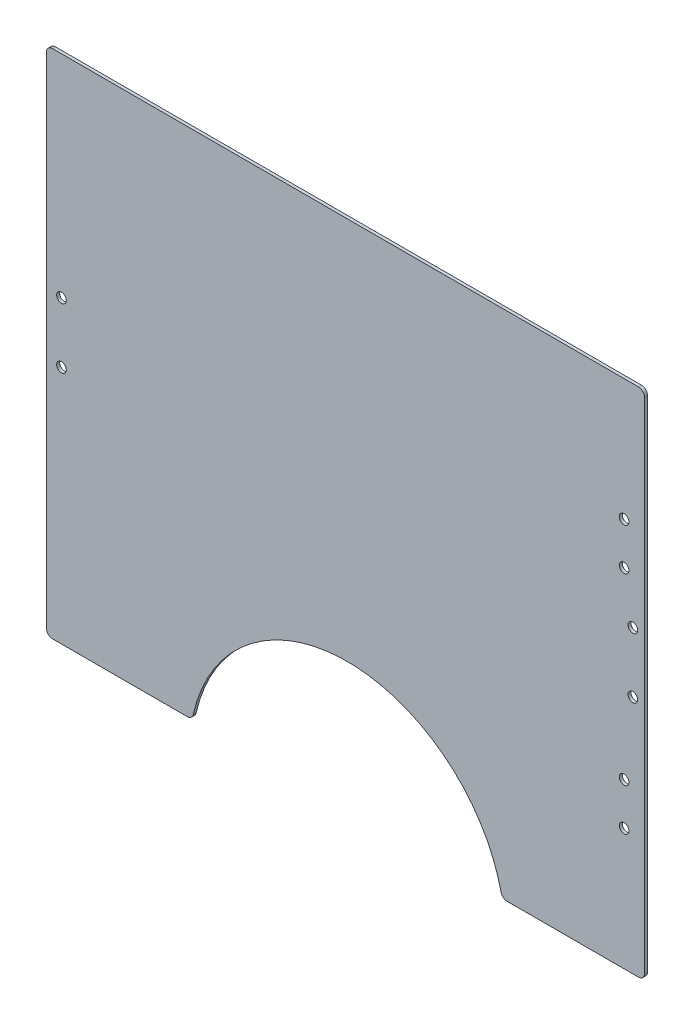
ISO-10303-21;
HEADER;
FILE_DESCRIPTION(('STEP AP214'),'2;1');
FILE_NAME('part.step','',(''),(''),'','','');
FILE_SCHEMA(('AUTOMOTIVE_DESIGN { 1 0 10303 214 1 1 1 1 }'));
ENDSEC;
DATA;
#1=APPLICATION_CONTEXT('core data for automotive mechanical design processes');
#2=APPLICATION_PROTOCOL_DEFINITION('international standard','automotive_design',2000,#1);
#3=PRODUCT_CONTEXT('',#1,'mechanical');
#4=PRODUCT('Part','Part','',(#3));
#5=PRODUCT_RELATED_PRODUCT_CATEGORY('part','',(#4));
#6=PRODUCT_DEFINITION_FORMATION('','',#4);
#7=PRODUCT_DEFINITION_CONTEXT('part definition',#1,'design');
#8=PRODUCT_DEFINITION('design','',#6,#7);
#9=PRODUCT_DEFINITION_SHAPE('','',#8);
#10=(LENGTH_UNIT() NAMED_UNIT(*) SI_UNIT(.MILLI.,.METRE.));
#11=(NAMED_UNIT(*) PLANE_ANGLE_UNIT() SI_UNIT($,.RADIAN.));
#12=(NAMED_UNIT(*) SI_UNIT($,.STERADIAN.) SOLID_ANGLE_UNIT());
#13=UNCERTAINTY_MEASURE_WITH_UNIT(LENGTH_MEASURE(1.E-05),#10,'distance_accuracy_value','');
#14=(GEOMETRIC_REPRESENTATION_CONTEXT(3) GLOBAL_UNCERTAINTY_ASSIGNED_CONTEXT((#13)) GLOBAL_UNIT_ASSIGNED_CONTEXT((#10,
#11,#12)) REPRESENTATION_CONTEXT('',''));
#15=CARTESIAN_POINT('',(0.,0.,0.));
#16=DIRECTION('',(0.,0.,1.));
#17=DIRECTION('',(1.,0.,0.));
#18=AXIS2_PLACEMENT_3D('',#15,#16,#17);
#19=CARTESIAN_POINT('',(-100.,-85.,1.));
#20=DIRECTION('',(0.,1.,0.));
#21=DIRECTION('',(0.,0.,1.));
#22=AXIS2_PLACEMENT_3D('',#19,#20,#21);
#23=PLANE('',#22);
#24=DIRECTION('',(1.,0.,0.));
#25=VECTOR('',#24,1.);
#26=CARTESIAN_POINT('',(-100.,-85.,0.));
#27=LINE('',#26,#25);
#28=CARTESIAN_POINT('',(53.1624867740402,-85.,0.));
#29=VERTEX_POINT('',#28);
#30=CARTESIAN_POINT('',(96.9,-85.,0.));
#31=VERTEX_POINT('',#30);
#32=EDGE_CURVE('E219',#29,#31,#27,.T.);
#33=ORIENTED_EDGE('',*,*,#32,.T.);
#34=DIRECTION('',(0.,0.,-1.));
#35=VECTOR('',#34,1.);
#36=CARTESIAN_POINT('',(96.9,-85.,1.));
#37=LINE('',#36,#35);
#38=CARTESIAN_POINT('',(96.9,-85.,1.));
#39=VERTEX_POINT('',#38);
#40=EDGE_CURVE('E181',#31,#39,#37,.F.);
#41=ORIENTED_EDGE('',*,*,#40,.T.);
#42=DIRECTION('',(1.,0.,0.));
#43=VECTOR('',#42,1.);
#44=CARTESIAN_POINT('',(-100.,-85.,1.));
#45=LINE('',#44,#43);
#46=CARTESIAN_POINT('',(53.1624867740402,-85.,1.));
#47=VERTEX_POINT('',#46);
#48=EDGE_CURVE('E205',#47,#39,#45,.T.);
#49=ORIENTED_EDGE('',*,*,#48,.F.);
#50=DIRECTION('',(0.,0.,-1.));
#51=VECTOR('',#50,1.);
#52=CARTESIAN_POINT('',(53.1624867740402,-85.,1.));
#53=LINE('',#52,#51);
#54=EDGE_CURVE('E134',#47,#29,#53,.T.);
#55=ORIENTED_EDGE('',*,*,#54,.T.);
#56=EDGE_LOOP('',(#33,#41,#49,#55));
#57=FACE_BOUND('',#56,.T.);
#58=ADVANCED_FACE('F36',(#57),#23,.F.);
#59=CARTESIAN_POINT('',(-100.,85.,1.));
#60=DIRECTION('',(0.,-1.,0.));
#61=DIRECTION('',(0.,0.,-1.));
#62=AXIS2_PLACEMENT_3D('',#59,#60,#61);
#63=PLANE('',#62);
#64=DIRECTION('',(-1.,0.,0.));
#65=VECTOR('',#64,1.);
#66=CARTESIAN_POINT('',(-100.,85.,1.));
#67=LINE('',#66,#65);
#68=CARTESIAN_POINT('',(96.9,85.,1.));
#69=VERTEX_POINT('',#68);
#70=CARTESIAN_POINT('',(-98.,85.,1.));
#71=VERTEX_POINT('',#70);
#72=EDGE_CURVE('E127',#69,#71,#67,.T.);
#73=ORIENTED_EDGE('',*,*,#72,.F.);
#74=DIRECTION('',(0.,0.,-1.));
#75=VECTOR('',#74,1.);
#76=CARTESIAN_POINT('',(96.9,85.,1.));
#77=LINE('',#76,#75);
#78=CARTESIAN_POINT('',(96.9,85.,0.));
#79=VERTEX_POINT('',#78);
#80=EDGE_CURVE('E141',#69,#79,#77,.T.);
#81=ORIENTED_EDGE('',*,*,#80,.T.);
#82=DIRECTION('',(-1.,0.,0.));
#83=VECTOR('',#82,1.);
#84=CARTESIAN_POINT('',(-100.,85.,0.));
#85=LINE('',#84,#83);
#86=CARTESIAN_POINT('',(-98.,85.,0.));
#87=VERTEX_POINT('',#86);
#88=EDGE_CURVE('E223',#79,#87,#85,.T.);
#89=ORIENTED_EDGE('',*,*,#88,.T.);
#90=DIRECTION('',(0.,0.,-1.));
#91=VECTOR('',#90,1.);
#92=CARTESIAN_POINT('',(-98.,85.,1.));
#93=LINE('',#92,#91);
#94=EDGE_CURVE('E144',#87,#71,#93,.F.);
#95=ORIENTED_EDGE('',*,*,#94,.T.);
#96=EDGE_LOOP('',(#73,#81,#89,#95));
#97=FACE_BOUND('',#96,.T.);
#98=ADVANCED_FACE('F139',(#97),#63,.F.);
#99=CARTESIAN_POINT('',(-100.,-85.,1.));
#100=DIRECTION('',(1.,0.,0.));
#101=DIRECTION('',(0.,0.,-1.));
#102=AXIS2_PLACEMENT_3D('',#99,#100,#101);
#103=PLANE('',#102);
#104=DIRECTION('',(0.,-1.,0.));
#105=VECTOR('',#104,1.);
#106=CARTESIAN_POINT('',(-100.,-85.,0.));
#107=LINE('',#106,#105);
#108=CARTESIAN_POINT('',(-100.,83.,0.));
#109=VERTEX_POINT('',#108);
#110=CARTESIAN_POINT('',(-100.,-83.,0.));
#111=VERTEX_POINT('',#110);
#112=EDGE_CURVE('E201',#109,#111,#107,.T.);
#113=ORIENTED_EDGE('',*,*,#112,.T.);
#114=DIRECTION('',(0.,0.,-1.));
#115=VECTOR('',#114,1.);
#116=CARTESIAN_POINT('',(-100.,-83.,1.));
#117=LINE('',#116,#115);
#118=CARTESIAN_POINT('',(-100.,-83.,1.));
#119=VERTEX_POINT('',#118);
#120=EDGE_CURVE('E192',#111,#119,#117,.F.);
#121=ORIENTED_EDGE('',*,*,#120,.T.);
#122=DIRECTION('',(0.,-1.,0.));
#123=VECTOR('',#122,1.);
#124=CARTESIAN_POINT('',(-100.,-85.,1.));
#125=LINE('',#124,#123);
#126=CARTESIAN_POINT('',(-100.,83.,1.));
#127=VERTEX_POINT('',#126);
#128=EDGE_CURVE('E145',#127,#119,#125,.T.);
#129=ORIENTED_EDGE('',*,*,#128,.F.);
#130=DIRECTION('',(0.,0.,-1.));
#131=VECTOR('',#130,1.);
#132=CARTESIAN_POINT('',(-100.,83.,1.));
#133=LINE('',#132,#131);
#134=EDGE_CURVE('E189',#127,#109,#133,.T.);
#135=ORIENTED_EDGE('',*,*,#134,.T.);
#136=EDGE_LOOP('',(#113,#121,#129,#135));
#137=FACE_BOUND('',#136,.T.);
#138=ADVANCED_FACE('F198',(#137),#103,.F.);
#139=CARTESIAN_POINT('',(-98.,-85.,1.));
#140=VERTEX_POINT('',#139);
#141=CARTESIAN_POINT('',(-53.1624867740402,-85.,1.));
#142=VERTEX_POINT('',#141);
#143=EDGE_CURVE('E154',#140,#142,#45,.T.);
#144=ORIENTED_EDGE('',*,*,#143,.F.);
#145=DIRECTION('',(0.,0.,-1.));
#146=VECTOR('',#145,1.);
#147=CARTESIAN_POINT('',(-98.,-85.,1.));
#148=LINE('',#147,#146);
#149=CARTESIAN_POINT('',(-98.,-85.,0.));
#150=VERTEX_POINT('',#149);
#151=EDGE_CURVE('E186',#140,#150,#148,.T.);
#152=ORIENTED_EDGE('',*,*,#151,.T.);
#153=CARTESIAN_POINT('',(-53.1624867740402,-85.,0.));
#154=VERTEX_POINT('',#153);
#155=EDGE_CURVE('E146',#150,#154,#27,.T.);
#156=ORIENTED_EDGE('',*,*,#155,.T.);
#157=DIRECTION('',(0.,0.,-1.));
#158=VECTOR('',#157,1.);
#159=CARTESIAN_POINT('',(-53.1624867740402,-85.,1.));
#160=LINE('',#159,#158);
#161=EDGE_CURVE('E183',#154,#142,#160,.F.);
#162=ORIENTED_EDGE('',*,*,#161,.T.);
#163=EDGE_LOOP('',(#144,#152,#156,#162));
#164=FACE_BOUND('',#163,.T.);
#165=ADVANCED_FACE('F212',(#164),#23,.F.);
#166=CARTESIAN_POINT('',(0.,0.,1.));
#167=DIRECTION('',(0.,0.,-1.));
#168=DIRECTION('',(-1.,0.,0.));
#169=AXIS2_PLACEMENT_3D('',#166,#167,#168);
#170=PLANE('',#169);
#171=CARTESIAN_POINT('',(92.1,44.5,0.999999999999999));
#172=DIRECTION('',(0.,0.,-1.));
#173=DIRECTION('',(-1.,0.,0.));
#174=AXIS2_PLACEMENT_3D('',#171,#172,#173);
#175=CIRCLE('',#174,1.60000000000001);
#176=CARTESIAN_POINT('',(90.5,44.5,0.999999999999999));
#177=VERTEX_POINT('',#176);
#178=EDGE_CURVE('E258',#177,#177,#175,.T.);
#179=ORIENTED_EDGE('',*,*,#178,.T.);
#180=EDGE_LOOP('',(#179));
#181=FACE_BOUND('',#180,.T.);
#182=CARTESIAN_POINT('',(92.1,30.5,0.999999999999999));
#183=DIRECTION('',(0.,0.,-1.));
#184=DIRECTION('',(-1.,0.,0.));
#185=AXIS2_PLACEMENT_3D('',#182,#183,#184);
#186=CIRCLE('',#185,1.6);
#187=CARTESIAN_POINT('',(90.5,30.5,0.999999999999999));
#188=VERTEX_POINT('',#187);
#189=EDGE_CURVE('E261',#188,#188,#186,.T.);
#190=ORIENTED_EDGE('',*,*,#189,.T.);
#191=EDGE_LOOP('',(#190));
#192=FACE_BOUND('',#191,.T.);
#193=CARTESIAN_POINT('',(92.1,-30.5000000000001,0.999999999999999));
#194=DIRECTION('',(0.,0.,-1.));
#195=DIRECTION('',(-1.,0.,0.));
#196=AXIS2_PLACEMENT_3D('',#193,#194,#195);
#197=CIRCLE('',#196,1.6);
#198=CARTESIAN_POINT('',(90.5,-30.5000000000001,0.999999999999999));
#199=VERTEX_POINT('',#198);
#200=EDGE_CURVE('E264',#199,#199,#197,.T.);
#201=ORIENTED_EDGE('',*,*,#200,.T.);
#202=EDGE_LOOP('',(#201));
#203=FACE_BOUND('',#202,.T.);
#204=CARTESIAN_POINT('',(92.1,-44.5000000000001,0.999999999999999));
#205=DIRECTION('',(0.,0.,-1.));
#206=DIRECTION('',(-1.,0.,0.));
#207=AXIS2_PLACEMENT_3D('',#204,#205,#206);
#208=CIRCLE('',#207,1.60000000000001);
#209=CARTESIAN_POINT('',(90.5,-44.5000000000001,0.999999999999999));
#210=VERTEX_POINT('',#209);
#211=EDGE_CURVE('E267',#210,#210,#208,.T.);
#212=ORIENTED_EDGE('',*,*,#211,.T.);
#213=EDGE_LOOP('',(#212));
#214=FACE_BOUND('',#213,.T.);
#215=CARTESIAN_POINT('',(95.,14.7224845011376,1.));
#216=DIRECTION('',(0.,0.,1.));
#217=DIRECTION('',(1.,0.,0.));
#218=AXIS2_PLACEMENT_3D('',#215,#216,#217);
#219=CIRCLE('',#218,1.6);
#220=CARTESIAN_POINT('',(96.6,14.7224845011376,1.));
#221=VERTEX_POINT('',#220);
#222=EDGE_CURVE('E235',#221,#221,#219,.T.);
#223=ORIENTED_EDGE('',*,*,#222,.F.);
#224=EDGE_LOOP('',(#223));
#225=FACE_BOUND('',#224,.T.);
#226=CARTESIAN_POINT('',(95.,-5.27751549886241,1.));
#227=DIRECTION('',(0.,0.,1.));
#228=DIRECTION('',(1.,0.,0.));
#229=AXIS2_PLACEMENT_3D('',#226,#227,#228);
#230=CIRCLE('',#229,1.60000000000001);
#231=CARTESIAN_POINT('',(96.6,-5.27751549886241,1.));
#232=VERTEX_POINT('',#231);
#233=EDGE_CURVE('E246',#232,#232,#230,.T.);
#234=ORIENTED_EDGE('',*,*,#233,.F.);
#235=EDGE_LOOP('',(#234));
#236=FACE_BOUND('',#235,.T.);
#237=CARTESIAN_POINT('',(-95.,14.7224845011376,1.));
#238=DIRECTION('',(0.,0.,-1.));
#239=DIRECTION('',(-1.,0.,0.));
#240=AXIS2_PLACEMENT_3D('',#237,#238,#239);
#241=CIRCLE('',#240,1.6);
#242=CARTESIAN_POINT('',(-96.6,14.7224845011376,1.));
#243=VERTEX_POINT('',#242);
#244=EDGE_CURVE('E230',#243,#243,#241,.T.);
#245=ORIENTED_EDGE('',*,*,#244,.T.);
#246=EDGE_LOOP('',(#245));
#247=FACE_BOUND('',#246,.T.);
#248=CARTESIAN_POINT('',(-95.,-5.27751549886241,1.));
#249=DIRECTION('',(0.,0.,-1.));
#250=DIRECTION('',(-1.,0.,0.));
#251=AXIS2_PLACEMENT_3D('',#248,#249,#250);
#252=CIRCLE('',#251,1.60000000000001);
#253=CARTESIAN_POINT('',(-96.6,-5.27751549886241,1.));
#254=VERTEX_POINT('',#253);
#255=EDGE_CURVE('E234',#254,#254,#252,.T.);
#256=ORIENTED_EDGE('',*,*,#255,.T.);
#257=EDGE_LOOP('',(#256));
#258=FACE_BOUND('',#257,.T.);
#259=DIRECTION('',(0.,1.,0.));
#260=VECTOR('',#259,1.);
#261=CARTESIAN_POINT('',(98.9,0.,1.));
#262=LINE('',#261,#260);
#263=CARTESIAN_POINT('',(98.9,-83.,1.));
#264=VERTEX_POINT('',#263);
#265=CARTESIAN_POINT('',(98.9,83.,1.));
#266=VERTEX_POINT('',#265);
#267=EDGE_CURVE('E130',#264,#266,#262,.T.);
#268=ORIENTED_EDGE('',*,*,#267,.T.);
#269=CARTESIAN_POINT('',(96.9,83.,1.));
#270=DIRECTION('',(0.,0.,-1.));
#271=DIRECTION('',(-1.,0.,0.));
#272=AXIS2_PLACEMENT_3D('',#269,#270,#271);
#273=CIRCLE('',#272,2.);
#274=EDGE_CURVE('E124',#266,#69,#273,.F.);
#275=ORIENTED_EDGE('',*,*,#274,.T.);
#276=ORIENTED_EDGE('',*,*,#72,.T.);
#277=CARTESIAN_POINT('',(-98.,83.,1.));
#278=DIRECTION('',(0.,0.,-1.));
#279=DIRECTION('',(-1.,0.,0.));
#280=AXIS2_PLACEMENT_3D('',#277,#278,#279);
#281=CIRCLE('',#280,2.);
#282=EDGE_CURVE('E174',#71,#127,#281,.F.);
#283=ORIENTED_EDGE('',*,*,#282,.T.);
#284=ORIENTED_EDGE('',*,*,#128,.T.);
#285=CARTESIAN_POINT('',(-98.,-83.,1.));
#286=DIRECTION('',(0.,0.,-1.));
#287=DIRECTION('',(-1.,0.,0.));
#288=AXIS2_PLACEMENT_3D('',#285,#286,#287);
#289=CIRCLE('',#288,2.);
#290=EDGE_CURVE('E176',#119,#140,#289,.F.);
#291=ORIENTED_EDGE('',*,*,#290,.T.);
#292=ORIENTED_EDGE('',*,*,#143,.T.);
#293=CARTESIAN_POINT('',(-53.1624867740402,-83.,1.));
#294=DIRECTION('',(0.,0.,-1.));
#295=DIRECTION('',(-1.,0.,0.));
#296=AXIS2_PLACEMENT_3D('',#293,#294,#295);
#297=CIRCLE('',#296,2.);
#298=CARTESIAN_POINT('',(-51.2115698282039,-83.4403669724771,1.));
#299=VERTEX_POINT('',#298);
#300=EDGE_CURVE('E57',#142,#299,#297,.F.);
#301=ORIENTED_EDGE('',*,*,#300,.T.);
#302=CARTESIAN_POINT('',(0.,-95.,1.));
#303=DIRECTION('',(0.,0.,-1.));
#304=DIRECTION('',(-1.,0.,0.));
#305=AXIS2_PLACEMENT_3D('',#302,#303,#304);
#306=CIRCLE('',#305,52.5);
#307=CARTESIAN_POINT('',(51.2115698282039,-83.4403669724771,1.));
#308=VERTEX_POINT('',#307);
#309=EDGE_CURVE('E225',#299,#308,#306,.T.);
#310=ORIENTED_EDGE('',*,*,#309,.T.);
#311=CARTESIAN_POINT('',(53.1624867740402,-83.,1.));
#312=DIRECTION('',(0.,0.,-1.));
#313=DIRECTION('',(-1.,0.,0.));
#314=AXIS2_PLACEMENT_3D('',#311,#312,#313);
#315=CIRCLE('',#314,2.);
#316=EDGE_CURVE('E171',#308,#47,#315,.F.);
#317=ORIENTED_EDGE('',*,*,#316,.T.);
#318=ORIENTED_EDGE('',*,*,#48,.T.);
#319=CARTESIAN_POINT('',(96.9,-83.,0.999999999999999));
#320=DIRECTION('',(0.,0.,-1.));
#321=DIRECTION('',(-1.,0.,0.));
#322=AXIS2_PLACEMENT_3D('',#319,#320,#321);
#323=CIRCLE('',#322,2.);
#324=EDGE_CURVE('E135',#39,#264,#323,.F.);
#325=ORIENTED_EDGE('',*,*,#324,.T.);
#326=EDGE_LOOP('',(#268,#275,#276,#283,#284,#291,#292,#301,#310,#317,#318,#325));
#327=FACE_BOUND('',#326,.T.);
#328=ADVANCED_FACE('F126',(#181,#192,#203,#214,#225,#236,#247,#258,#327),#170,.F.);
#329=CARTESIAN_POINT('',(0.,0.,0.));
#330=DIRECTION('',(0.,0.,-1.));
#331=DIRECTION('',(-1.,0.,0.));
#332=AXIS2_PLACEMENT_3D('',#329,#330,#331);
#333=PLANE('',#332);
#334=CARTESIAN_POINT('',(92.1,44.5,0.));
#335=DIRECTION('',(0.,0.,-1.));
#336=DIRECTION('',(-1.,0.,0.));
#337=AXIS2_PLACEMENT_3D('',#334,#335,#336);
#338=CIRCLE('',#337,1.60000000000001);
#339=CARTESIAN_POINT('',(90.5,44.5,0.));
#340=VERTEX_POINT('',#339);
#341=EDGE_CURVE('E270',#340,#340,#338,.T.);
#342=ORIENTED_EDGE('',*,*,#341,.F.);
#343=EDGE_LOOP('',(#342));
#344=FACE_BOUND('',#343,.T.);
#345=CARTESIAN_POINT('',(92.1,30.5,0.));
#346=DIRECTION('',(0.,0.,-1.));
#347=DIRECTION('',(-1.,0.,0.));
#348=AXIS2_PLACEMENT_3D('',#345,#346,#347);
#349=CIRCLE('',#348,1.6);
#350=CARTESIAN_POINT('',(90.5,30.5,0.));
#351=VERTEX_POINT('',#350);
#352=EDGE_CURVE('E277',#351,#351,#349,.T.);
#353=ORIENTED_EDGE('',*,*,#352,.F.);
#354=EDGE_LOOP('',(#353));
#355=FACE_BOUND('',#354,.T.);
#356=CARTESIAN_POINT('',(92.1,-30.5000000000001,0.));
#357=DIRECTION('',(0.,0.,-1.));
#358=DIRECTION('',(-1.,0.,0.));
#359=AXIS2_PLACEMENT_3D('',#356,#357,#358);
#360=CIRCLE('',#359,1.6);
#361=CARTESIAN_POINT('',(90.5,-30.5000000000001,0.));
#362=VERTEX_POINT('',#361);
#363=EDGE_CURVE('E274',#362,#362,#360,.T.);
#364=ORIENTED_EDGE('',*,*,#363,.F.);
#365=EDGE_LOOP('',(#364));
#366=FACE_BOUND('',#365,.T.);
#367=CARTESIAN_POINT('',(92.1,-44.5000000000001,0.));
#368=DIRECTION('',(0.,0.,-1.));
#369=DIRECTION('',(-1.,0.,0.));
#370=AXIS2_PLACEMENT_3D('',#367,#368,#369);
#371=CIRCLE('',#370,1.60000000000001);
#372=CARTESIAN_POINT('',(90.5,-44.5000000000001,0.));
#373=VERTEX_POINT('',#372);
#374=EDGE_CURVE('E271',#373,#373,#371,.T.);
#375=ORIENTED_EDGE('',*,*,#374,.F.);
#376=EDGE_LOOP('',(#375));
#377=FACE_BOUND('',#376,.T.);
#378=ORIENTED_EDGE('',*,*,#88,.F.);
#379=CARTESIAN_POINT('',(96.9,83.,0.));
#380=DIRECTION('',(0.,0.,-1.));
#381=DIRECTION('',(-1.,0.,0.));
#382=AXIS2_PLACEMENT_3D('',#379,#380,#381);
#383=CIRCLE('',#382,2.);
#384=CARTESIAN_POINT('',(98.9,83.,0.));
#385=VERTEX_POINT('',#384);
#386=EDGE_CURVE('E149',#79,#385,#383,.T.);
#387=ORIENTED_EDGE('',*,*,#386,.T.);
#388=DIRECTION('',(0.,1.,0.));
#389=VECTOR('',#388,1.);
#390=CARTESIAN_POINT('',(98.9,-85.,0.));
#391=LINE('',#390,#389);
#392=CARTESIAN_POINT('',(98.9,-83.,0.));
#393=VERTEX_POINT('',#392);
#394=EDGE_CURVE('E255',#393,#385,#391,.T.);
#395=ORIENTED_EDGE('',*,*,#394,.F.);
#396=CARTESIAN_POINT('',(96.9,-83.,0.));
#397=DIRECTION('',(0.,0.,-1.));
#398=DIRECTION('',(-1.,0.,0.));
#399=AXIS2_PLACEMENT_3D('',#396,#397,#398);
#400=CIRCLE('',#399,2.);
#401=EDGE_CURVE('E163',#393,#31,#400,.T.);
#402=ORIENTED_EDGE('',*,*,#401,.T.);
#403=ORIENTED_EDGE('',*,*,#32,.F.);
#404=CARTESIAN_POINT('',(53.1624867740402,-83.,0.));
#405=DIRECTION('',(0.,0.,-1.));
#406=DIRECTION('',(-1.,0.,0.));
#407=AXIS2_PLACEMENT_3D('',#404,#405,#406);
#408=CIRCLE('',#407,2.);
#409=CARTESIAN_POINT('',(51.2115698282039,-83.4403669724771,0.));
#410=VERTEX_POINT('',#409);
#411=EDGE_CURVE('E150',#29,#410,#408,.T.);
#412=ORIENTED_EDGE('',*,*,#411,.T.);
#413=CARTESIAN_POINT('',(0.,-95.,0.));
#414=DIRECTION('',(0.,0.,-1.));
#415=DIRECTION('',(-1.,0.,0.));
#416=AXIS2_PLACEMENT_3D('',#413,#414,#415);
#417=CIRCLE('',#416,52.5);
#418=CARTESIAN_POINT('',(-51.2115698282039,-83.4403669724771,0.));
#419=VERTEX_POINT('',#418);
#420=EDGE_CURVE('E228',#419,#410,#417,.T.);
#421=ORIENTED_EDGE('',*,*,#420,.F.);
#422=CARTESIAN_POINT('',(-53.1624867740402,-83.,0.));
#423=DIRECTION('',(0.,0.,-1.));
#424=DIRECTION('',(-1.,0.,0.));
#425=AXIS2_PLACEMENT_3D('',#422,#423,#424);
#426=CIRCLE('',#425,2.);
#427=EDGE_CURVE('E152',#419,#154,#426,.T.);
#428=ORIENTED_EDGE('',*,*,#427,.T.);
#429=ORIENTED_EDGE('',*,*,#155,.F.);
#430=CARTESIAN_POINT('',(-98.,-83.,0.));
#431=DIRECTION('',(0.,0.,-1.));
#432=DIRECTION('',(-1.,0.,0.));
#433=AXIS2_PLACEMENT_3D('',#430,#431,#432);
#434=CIRCLE('',#433,2.);
#435=EDGE_CURVE('E161',#150,#111,#434,.T.);
#436=ORIENTED_EDGE('',*,*,#435,.T.);
#437=ORIENTED_EDGE('',*,*,#112,.F.);
#438=CARTESIAN_POINT('',(-98.,83.,0.));
#439=DIRECTION('',(0.,0.,-1.));
#440=DIRECTION('',(-1.,0.,0.));
#441=AXIS2_PLACEMENT_3D('',#438,#439,#440);
#442=CIRCLE('',#441,2.);
#443=EDGE_CURVE('E159',#109,#87,#442,.T.);
#444=ORIENTED_EDGE('',*,*,#443,.T.);
#445=EDGE_LOOP('',(#378,#387,#395,#402,#403,#412,#421,#428,#429,#436,#437,#444));
#446=FACE_BOUND('',#445,.T.);
#447=CARTESIAN_POINT('',(95.,14.7224845011376,0.));
#448=DIRECTION('',(0.,0.,1.));
#449=DIRECTION('',(1.,0.,0.));
#450=AXIS2_PLACEMENT_3D('',#447,#448,#449);
#451=CIRCLE('',#450,1.6);
#452=CARTESIAN_POINT('',(96.6,14.7224845011376,0.));
#453=VERTEX_POINT('',#452);
#454=EDGE_CURVE('E249',#453,#453,#451,.T.);
#455=ORIENTED_EDGE('',*,*,#454,.T.);
#456=EDGE_LOOP('',(#455));
#457=FACE_BOUND('',#456,.T.);
#458=CARTESIAN_POINT('',(95.,-5.27751549886241,0.));
#459=DIRECTION('',(0.,0.,1.));
#460=DIRECTION('',(1.,0.,0.));
#461=AXIS2_PLACEMENT_3D('',#458,#459,#460);
#462=CIRCLE('',#461,1.60000000000001);
#463=CARTESIAN_POINT('',(96.6,-5.27751549886241,0.));
#464=VERTEX_POINT('',#463);
#465=EDGE_CURVE('E243',#464,#464,#462,.T.);
#466=ORIENTED_EDGE('',*,*,#465,.T.);
#467=EDGE_LOOP('',(#466));
#468=FACE_BOUND('',#467,.T.);
#469=CARTESIAN_POINT('',(-95.,14.7224845011376,0.));
#470=DIRECTION('',(0.,0.,-1.));
#471=DIRECTION('',(-1.,0.,0.));
#472=AXIS2_PLACEMENT_3D('',#469,#470,#471);
#473=CIRCLE('',#472,1.6);
#474=CARTESIAN_POINT('',(-96.6,14.7224845011376,0.));
#475=VERTEX_POINT('',#474);
#476=EDGE_CURVE('E238',#475,#475,#473,.T.);
#477=ORIENTED_EDGE('',*,*,#476,.F.);
#478=EDGE_LOOP('',(#477));
#479=FACE_BOUND('',#478,.T.);
#480=CARTESIAN_POINT('',(-95.,-5.27751549886241,0.));
#481=DIRECTION('',(0.,0.,-1.));
#482=DIRECTION('',(-1.,0.,0.));
#483=AXIS2_PLACEMENT_3D('',#480,#481,#482);
#484=CIRCLE('',#483,1.60000000000001);
#485=CARTESIAN_POINT('',(-96.6,-5.27751549886241,0.));
#486=VERTEX_POINT('',#485);
#487=EDGE_CURVE('E231',#486,#486,#484,.T.);
#488=ORIENTED_EDGE('',*,*,#487,.F.);
#489=EDGE_LOOP('',(#488));
#490=FACE_BOUND('',#489,.T.);
#491=ADVANCED_FACE('F215',(#344,#355,#366,#377,#446,#457,#468,#479,#490),#333,.T.);
#492=CARTESIAN_POINT('',(0.,-95.,2.));
#493=DIRECTION('',(0.,0.,-1.));
#494=DIRECTION('',(-1.,0.,0.));
#495=AXIS2_PLACEMENT_3D('',#492,#493,#494);
#496=CYLINDRICAL_SURFACE('',#495,52.5);
#497=ORIENTED_EDGE('',*,*,#309,.F.);
#498=DIRECTION('',(0.,0.,-1.));
#499=VECTOR('',#498,1.);
#500=CARTESIAN_POINT('',(-51.2115698282039,-83.4403669724771,2.));
#501=LINE('',#500,#499);
#502=EDGE_CURVE('E11',#299,#419,#501,.T.);
#503=ORIENTED_EDGE('',*,*,#502,.T.);
#504=ORIENTED_EDGE('',*,*,#420,.T.);
#505=DIRECTION('',(0.,0.,-1.));
#506=VECTOR('',#505,1.);
#507=CARTESIAN_POINT('',(51.2115698282039,-83.4403669724771,2.));
#508=LINE('',#507,#506);
#509=EDGE_CURVE('E44',#410,#308,#508,.F.);
#510=ORIENTED_EDGE('',*,*,#509,.T.);
#511=EDGE_LOOP('',(#497,#503,#504,#510));
#512=FACE_BOUND('',#511,.T.);
#513=ADVANCED_FACE('F288',(#512),#496,.F.);
#514=CARTESIAN_POINT('',(-95.,-5.27751549886241,1.));
#515=DIRECTION('',(0.,0.,-1.));
#516=DIRECTION('',(-1.,0.,0.));
#517=AXIS2_PLACEMENT_3D('',#514,#515,#516);
#518=CYLINDRICAL_SURFACE('',#517,1.60000000000001);
#519=ORIENTED_EDGE('',*,*,#255,.F.);
#520=EDGE_LOOP('',(#519));
#521=FACE_BOUND('',#520,.T.);
#522=ORIENTED_EDGE('',*,*,#487,.T.);
#523=EDGE_LOOP('',(#522));
#524=FACE_BOUND('',#523,.T.);
#525=ADVANCED_FACE('F315',(#521,#524),#518,.F.);
#526=CARTESIAN_POINT('',(-95.,14.7224845011376,1.));
#527=DIRECTION('',(0.,0.,-1.));
#528=DIRECTION('',(-1.,0.,0.));
#529=AXIS2_PLACEMENT_3D('',#526,#527,#528);
#530=CYLINDRICAL_SURFACE('',#529,1.6);
#531=ORIENTED_EDGE('',*,*,#244,.F.);
#532=EDGE_LOOP('',(#531));
#533=FACE_BOUND('',#532,.T.);
#534=ORIENTED_EDGE('',*,*,#476,.T.);
#535=EDGE_LOOP('',(#534));
#536=FACE_BOUND('',#535,.T.);
#537=ADVANCED_FACE('F318',(#533,#536),#530,.F.);
#538=CARTESIAN_POINT('',(95.,-5.27751549886241,1.));
#539=DIRECTION('',(0.,0.,-1.));
#540=DIRECTION('',(-1.,0.,0.));
#541=AXIS2_PLACEMENT_3D('',#538,#539,#540);
#542=CYLINDRICAL_SURFACE('',#541,1.60000000000001);
#543=ORIENTED_EDGE('',*,*,#233,.T.);
#544=EDGE_LOOP('',(#543));
#545=FACE_BOUND('',#544,.T.);
#546=ORIENTED_EDGE('',*,*,#465,.F.);
#547=EDGE_LOOP('',(#546));
#548=FACE_BOUND('',#547,.T.);
#549=ADVANCED_FACE('F326',(#545,#548),#542,.F.);
#550=CARTESIAN_POINT('',(95.,14.7224845011376,1.));
#551=DIRECTION('',(0.,0.,-1.));
#552=DIRECTION('',(-1.,0.,0.));
#553=AXIS2_PLACEMENT_3D('',#550,#551,#552);
#554=CYLINDRICAL_SURFACE('',#553,1.6);
#555=ORIENTED_EDGE('',*,*,#222,.T.);
#556=EDGE_LOOP('',(#555));
#557=FACE_BOUND('',#556,.T.);
#558=ORIENTED_EDGE('',*,*,#454,.F.);
#559=EDGE_LOOP('',(#558));
#560=FACE_BOUND('',#559,.T.);
#561=ADVANCED_FACE('F376',(#557,#560),#554,.F.);
#562=CARTESIAN_POINT('',(98.9,-85.,10.));
#563=DIRECTION('',(-1.,0.,0.));
#564=DIRECTION('',(0.,0.,1.));
#565=AXIS2_PLACEMENT_3D('',#562,#563,#564);
#566=PLANE('',#565);
#567=ORIENTED_EDGE('',*,*,#394,.T.);
#568=DIRECTION('',(0.,0.,-1.));
#569=VECTOR('',#568,1.);
#570=CARTESIAN_POINT('',(98.9,83.,10.));
#571=LINE('',#570,#569);
#572=EDGE_CURVE('E169',#385,#266,#571,.F.);
#573=ORIENTED_EDGE('',*,*,#572,.T.);
#574=ORIENTED_EDGE('',*,*,#267,.F.);
#575=DIRECTION('',(0.,0.,-1.));
#576=VECTOR('',#575,1.);
#577=CARTESIAN_POINT('',(98.9,-83.,10.));
#578=LINE('',#577,#576);
#579=EDGE_CURVE('E166',#264,#393,#578,.T.);
#580=ORIENTED_EDGE('',*,*,#579,.T.);
#581=EDGE_LOOP('',(#567,#573,#574,#580));
#582=FACE_BOUND('',#581,.T.);
#583=ADVANCED_FACE('F348',(#582),#566,.F.);
#584=CARTESIAN_POINT('',(96.9,83.,1.));
#585=DIRECTION('',(0.,0.,-1.));
#586=DIRECTION('',(-1.,0.,0.));
#587=AXIS2_PLACEMENT_3D('',#584,#585,#586);
#588=CYLINDRICAL_SURFACE('',#587,2.);
#589=ORIENTED_EDGE('',*,*,#274,.F.);
#590=ORIENTED_EDGE('',*,*,#572,.F.);
#591=ORIENTED_EDGE('',*,*,#386,.F.);
#592=ORIENTED_EDGE('',*,*,#80,.F.);
#593=EDGE_LOOP('',(#589,#590,#591,#592));
#594=FACE_BOUND('',#593,.T.);
#595=ADVANCED_FACE('F148',(#594),#588,.T.);
#596=CARTESIAN_POINT('',(96.9,-83.,10.));
#597=DIRECTION('',(0.,0.,-1.));
#598=DIRECTION('',(-1.,0.,0.));
#599=AXIS2_PLACEMENT_3D('',#596,#597,#598);
#600=CYLINDRICAL_SURFACE('',#599,2.);
#601=ORIENTED_EDGE('',*,*,#324,.F.);
#602=ORIENTED_EDGE('',*,*,#40,.F.);
#603=ORIENTED_EDGE('',*,*,#401,.F.);
#604=ORIENTED_EDGE('',*,*,#579,.F.);
#605=EDGE_LOOP('',(#601,#602,#603,#604));
#606=FACE_BOUND('',#605,.T.);
#607=ADVANCED_FACE('F347',(#606),#600,.T.);
#608=CARTESIAN_POINT('',(-98.,-83.,1.));
#609=DIRECTION('',(0.,0.,-1.));
#610=DIRECTION('',(-1.,0.,0.));
#611=AXIS2_PLACEMENT_3D('',#608,#609,#610);
#612=CYLINDRICAL_SURFACE('',#611,2.);
#613=ORIENTED_EDGE('',*,*,#290,.F.);
#614=ORIENTED_EDGE('',*,*,#120,.F.);
#615=ORIENTED_EDGE('',*,*,#435,.F.);
#616=ORIENTED_EDGE('',*,*,#151,.F.);
#617=EDGE_LOOP('',(#613,#614,#615,#616));
#618=FACE_BOUND('',#617,.T.);
#619=ADVANCED_FACE('F208',(#618),#612,.T.);
#620=CARTESIAN_POINT('',(-98.,83.,1.));
#621=DIRECTION('',(0.,0.,-1.));
#622=DIRECTION('',(-1.,0.,0.));
#623=AXIS2_PLACEMENT_3D('',#620,#621,#622);
#624=CYLINDRICAL_SURFACE('',#623,2.);
#625=ORIENTED_EDGE('',*,*,#282,.F.);
#626=ORIENTED_EDGE('',*,*,#94,.F.);
#627=ORIENTED_EDGE('',*,*,#443,.F.);
#628=ORIENTED_EDGE('',*,*,#134,.F.);
#629=EDGE_LOOP('',(#625,#626,#627,#628));
#630=FACE_BOUND('',#629,.T.);
#631=ADVANCED_FACE('F354',(#630),#624,.T.);
#632=CARTESIAN_POINT('',(-53.1624867740402,-83.,2.));
#633=DIRECTION('',(0.,0.,-1.));
#634=DIRECTION('',(-1.,0.,0.));
#635=AXIS2_PLACEMENT_3D('',#632,#633,#634);
#636=CYLINDRICAL_SURFACE('',#635,2.);
#637=ORIENTED_EDGE('',*,*,#427,.F.);
#638=ORIENTED_EDGE('',*,*,#502,.F.);
#639=ORIENTED_EDGE('',*,*,#300,.F.);
#640=ORIENTED_EDGE('',*,*,#161,.F.);
#641=EDGE_LOOP('',(#637,#638,#639,#640));
#642=FACE_BOUND('',#641,.T.);
#643=ADVANCED_FACE('F356',(#642),#636,.T.);
#644=CARTESIAN_POINT('',(53.1624867740402,-83.,2.));
#645=DIRECTION('',(0.,0.,-1.));
#646=DIRECTION('',(-1.,0.,0.));
#647=AXIS2_PLACEMENT_3D('',#644,#645,#646);
#648=CYLINDRICAL_SURFACE('',#647,2.);
#649=ORIENTED_EDGE('',*,*,#316,.F.);
#650=ORIENTED_EDGE('',*,*,#509,.F.);
#651=ORIENTED_EDGE('',*,*,#411,.F.);
#652=ORIENTED_EDGE('',*,*,#54,.F.);
#653=EDGE_LOOP('',(#649,#650,#651,#652));
#654=FACE_BOUND('',#653,.T.);
#655=ADVANCED_FACE('F38',(#654),#648,.T.);
#656=CARTESIAN_POINT('',(92.1,-44.5000000000001,10.));
#657=DIRECTION('',(0.,0.,-1.));
#658=DIRECTION('',(-1.,0.,0.));
#659=AXIS2_PLACEMENT_3D('',#656,#657,#658);
#660=CYLINDRICAL_SURFACE('',#659,1.60000000000001);
#661=ORIENTED_EDGE('',*,*,#374,.T.);
#662=EDGE_LOOP('',(#661));
#663=FACE_BOUND('',#662,.T.);
#664=ORIENTED_EDGE('',*,*,#211,.F.);
#665=EDGE_LOOP('',(#664));
#666=FACE_BOUND('',#665,.T.);
#667=ADVANCED_FACE('F296',(#663,#666),#660,.F.);
#668=CARTESIAN_POINT('',(92.1,-30.5000000000001,10.));
#669=DIRECTION('',(0.,0.,-1.));
#670=DIRECTION('',(-1.,0.,0.));
#671=AXIS2_PLACEMENT_3D('',#668,#669,#670);
#672=CYLINDRICAL_SURFACE('',#671,1.6);
#673=ORIENTED_EDGE('',*,*,#363,.T.);
#674=EDGE_LOOP('',(#673));
#675=FACE_BOUND('',#674,.T.);
#676=ORIENTED_EDGE('',*,*,#200,.F.);
#677=EDGE_LOOP('',(#676));
#678=FACE_BOUND('',#677,.T.);
#679=ADVANCED_FACE('F299',(#675,#678),#672,.F.);
#680=CARTESIAN_POINT('',(92.1,30.5,10.));
#681=DIRECTION('',(0.,0.,-1.));
#682=DIRECTION('',(-1.,0.,0.));
#683=AXIS2_PLACEMENT_3D('',#680,#681,#682);
#684=CYLINDRICAL_SURFACE('',#683,1.6);
#685=ORIENTED_EDGE('',*,*,#352,.T.);
#686=EDGE_LOOP('',(#685));
#687=FACE_BOUND('',#686,.T.);
#688=ORIENTED_EDGE('',*,*,#189,.F.);
#689=EDGE_LOOP('',(#688));
#690=FACE_BOUND('',#689,.T.);
#691=ADVANCED_FACE('F491',(#687,#690),#684,.F.);
#692=CARTESIAN_POINT('',(92.1,44.5,10.));
#693=DIRECTION('',(0.,0.,-1.));
#694=DIRECTION('',(-1.,0.,0.));
#695=AXIS2_PLACEMENT_3D('',#692,#693,#694);
#696=CYLINDRICAL_SURFACE('',#695,1.60000000000001);
#697=ORIENTED_EDGE('',*,*,#341,.T.);
#698=EDGE_LOOP('',(#697));
#699=FACE_BOUND('',#698,.T.);
#700=ORIENTED_EDGE('',*,*,#178,.F.);
#701=EDGE_LOOP('',(#700));
#702=FACE_BOUND('',#701,.T.);
#703=ADVANCED_FACE('F283',(#699,#702),#696,.F.);
#704=CLOSED_SHELL('',(#58,#98,#138,#165,#328,#491,#513,#525,#537,#549,#561,#583,#595,#607,#619,
#631,#643,#655,#667,#679,#691,#703));
#705=MANIFOLD_SOLID_BREP('B2',#704);
#706=ADVANCED_BREP_SHAPE_REPRESENTATION('',(#18,#705),#14);
#707=SHAPE_DEFINITION_REPRESENTATION(#9,#706);
ENDSEC;
END-ISO-10303-21;
